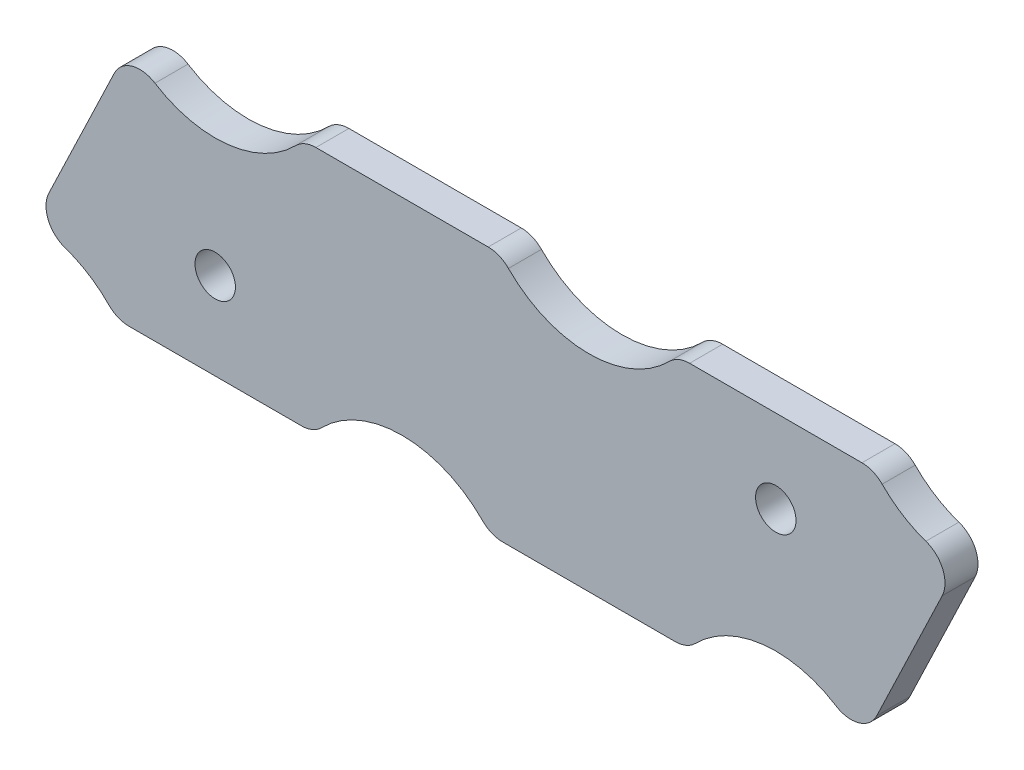
ISO-10303-21;
HEADER;
FILE_DESCRIPTION(('STEP AP214'),'2;1');
FILE_NAME('part.step','',(''),(''),'','','');
FILE_SCHEMA(('AUTOMOTIVE_DESIGN { 1 0 10303 214 1 1 1 1 }'));
ENDSEC;
DATA;
#1=APPLICATION_CONTEXT('core data for automotive mechanical design processes');
#2=APPLICATION_PROTOCOL_DEFINITION('international standard','automotive_design',2000,#1);
#3=PRODUCT_CONTEXT('',#1,'mechanical');
#4=PRODUCT('Part','Part','',(#3));
#5=PRODUCT_RELATED_PRODUCT_CATEGORY('part','',(#4));
#6=PRODUCT_DEFINITION_FORMATION('','',#4);
#7=PRODUCT_DEFINITION_CONTEXT('part definition',#1,'design');
#8=PRODUCT_DEFINITION('design','',#6,#7);
#9=PRODUCT_DEFINITION_SHAPE('','',#8);
#10=(LENGTH_UNIT() NAMED_UNIT(*) SI_UNIT(.MILLI.,.METRE.));
#11=(NAMED_UNIT(*) PLANE_ANGLE_UNIT() SI_UNIT($,.RADIAN.));
#12=(NAMED_UNIT(*) SI_UNIT($,.STERADIAN.) SOLID_ANGLE_UNIT());
#13=UNCERTAINTY_MEASURE_WITH_UNIT(LENGTH_MEASURE(1.E-05),#10,'distance_accuracy_value','');
#14=(GEOMETRIC_REPRESENTATION_CONTEXT(3) GLOBAL_UNCERTAINTY_ASSIGNED_CONTEXT((#13)) GLOBAL_UNIT_ASSIGNED_CONTEXT((#10,
#11,#12)) REPRESENTATION_CONTEXT('',''));
#15=CARTESIAN_POINT('',(0.,0.,0.));
#16=DIRECTION('',(0.,0.,1.));
#17=DIRECTION('',(1.,0.,0.));
#18=AXIS2_PLACEMENT_3D('',#15,#16,#17);
#19=CARTESIAN_POINT('',(0.,0.,2.032));
#20=DIRECTION('',(0.,0.,1.));
#21=DIRECTION('',(1.,0.,0.));
#22=AXIS2_PLACEMENT_3D('',#19,#20,#21);
#23=PLANE('',#22);
#24=CARTESIAN_POINT('',(56.7749999999999,25.3070138776259,2.032));
#25=DIRECTION('',(0.,0.,1.));
#26=DIRECTION('',(1.,0.,0.));
#27=AXIS2_PLACEMENT_3D('',#24,#25,#26);
#28=CIRCLE('',#27,1.2446);
#29=CARTESIAN_POINT('',(58.0195999999999,25.3070138776259,2.032));
#30=VERTEX_POINT('',#29);
#31=EDGE_CURVE('E403',#30,#30,#28,.T.);
#32=ORIENTED_EDGE('',*,*,#31,.F.);
#33=EDGE_LOOP('',(#32));
#34=FACE_BOUND('',#33,.T.);
#35=CARTESIAN_POINT('',(22.275,20.4920677095079,2.032));
#36=DIRECTION('',(0.,0.,1.));
#37=DIRECTION('',(1.,0.,0.));
#38=AXIS2_PLACEMENT_3D('',#35,#36,#37);
#39=CIRCLE('',#38,1.2446);
#40=CARTESIAN_POINT('',(23.5196,20.4920677095079,2.032));
#41=VERTEX_POINT('',#40);
#42=EDGE_CURVE('E53',#41,#41,#39,.T.);
#43=ORIENTED_EDGE('',*,*,#42,.F.);
#44=EDGE_LOOP('',(#43));
#45=FACE_BOUND('',#44,.T.);
#46=CARTESIAN_POINT('',(22.275,34.775,2.032));
#47=DIRECTION('',(0.,0.,-1.));
#48=DIRECTION('',(1.,0.,0.));
#49=AXIS2_PLACEMENT_3D('',#46,#47,#48);
#50=CIRCLE('',#49,6.954);
#51=CARTESIAN_POINT('',(27.228374403337,29.8942010878991,2.032));
#52=VERTEX_POINT('',#51);
#53=CARTESIAN_POINT('',(18.5691218534122,28.8907342715813,2.032));
#54=VERTEX_POINT('',#53);
#55=EDGE_CURVE('E356',#52,#54,#50,.T.);
#56=ORIENTED_EDGE('',*,*,#55,.T.);
#57=CARTESIAN_POINT('',(17.6386554680308,27.4133215649636,2.032));
#58=DIRECTION('',(0.,0.,1.));
#59=DIRECTION('',(1.,0.,0.));
#60=AXIS2_PLACEMENT_3D('',#57,#58,#59);
#61=CIRCLE('',#60,1.746);
#62=CARTESIAN_POINT('',(16.0640846818776,28.1678033999954,2.032));
#63=VERTEX_POINT('',#62);
#64=EDGE_CURVE('E291',#54,#63,#61,.T.);
#65=ORIENTED_EDGE('',*,*,#64,.T.);
#66=DIRECTION('',(-0.432120180430553,-0.901816028724632,0.));
#67=VECTOR('',#66,1.);
#68=CARTESIAN_POINT('',(16.0640846818776,28.1678033999954,2.032));
#69=LINE('',#68,#67);
#70=CARTESIAN_POINT('',(12.0331416883667,19.7554006309292,2.032));
#71=VERTEX_POINT('',#70);
#72=EDGE_CURVE('E294',#63,#71,#69,.T.);
#73=ORIENTED_EDGE('',*,*,#72,.T.);
#74=CARTESIAN_POINT('',(13.6077124745199,19.0009187958975,2.032));
#75=DIRECTION('',(0.,0.,1.));
#76=DIRECTION('',(1.,0.,0.));
#77=AXIS2_PLACEMENT_3D('',#74,#75,#76);
#78=CIRCLE('',#77,1.746);
#79=CARTESIAN_POINT('',(13.0392163848059,17.3500619892725,2.032));
#80=VERTEX_POINT('',#79);
#81=EDGE_CURVE('E61',#71,#80,#78,.T.);
#82=ORIENTED_EDGE('',*,*,#81,.T.);
#83=CARTESIAN_POINT('',(10.775,10.775,2.032));
#84=DIRECTION('',(0.,0.,-1.));
#85=DIRECTION('',(1.,0.,0.));
#86=AXIS2_PLACEMENT_3D('',#83,#84,#85);
#87=CIRCLE('',#86,6.954);
#88=CARTESIAN_POINT('',(15.728374403337,15.6557989121009,2.032));
#89=VERTEX_POINT('',#88);
#90=EDGE_CURVE('E214',#80,#89,#87,.T.);
#91=ORIENTED_EDGE('',*,*,#90,.T.);
#92=CARTESIAN_POINT('',(16.9720602975312,16.8812626596603,2.032));
#93=DIRECTION('',(0.,0.,1.));
#94=DIRECTION('',(1.,0.,0.));
#95=AXIS2_PLACEMENT_3D('',#92,#93,#94);
#96=CIRCLE('',#95,1.746);
#97=CARTESIAN_POINT('',(16.9720602975312,15.1352626596603,2.032));
#98=VERTEX_POINT('',#97);
#99=EDGE_CURVE('E299',#89,#98,#96,.T.);
#100=ORIENTED_EDGE('',*,*,#99,.T.);
#101=DIRECTION('',(1.,0.,0.));
#102=VECTOR('',#101,1.);
#103=CARTESIAN_POINT('',(16.9720602975312,15.1352626596603,2.032));
#104=LINE('',#103,#102);
#105=CARTESIAN_POINT('',(27.5779397024688,15.1352626596603,2.032));
#106=VERTEX_POINT('',#105);
#107=EDGE_CURVE('E302',#98,#106,#104,.T.);
#108=ORIENTED_EDGE('',*,*,#107,.T.);
#109=CARTESIAN_POINT('',(27.5779397024688,16.8812626596603,2.032));
#110=DIRECTION('',(0.,0.,1.));
#111=DIRECTION('',(1.,0.,0.));
#112=AXIS2_PLACEMENT_3D('',#109,#110,#111);
#113=CIRCLE('',#112,1.746);
#114=CARTESIAN_POINT('',(28.821625596663,15.6557989121009,2.032));
#115=VERTEX_POINT('',#114);
#116=EDGE_CURVE('E305',#106,#115,#113,.T.);
#117=ORIENTED_EDGE('',*,*,#116,.T.);
#118=CARTESIAN_POINT('',(33.775,10.775,2.032));
#119=DIRECTION('',(0.,0.,-1.));
#120=DIRECTION('',(1.,0.,0.));
#121=AXIS2_PLACEMENT_3D('',#118,#119,#120);
#122=CIRCLE('',#121,6.954);
#123=CARTESIAN_POINT('',(38.728374403337,15.6557989121009,2.032));
#124=VERTEX_POINT('',#123);
#125=EDGE_CURVE('E308',#115,#124,#122,.T.);
#126=ORIENTED_EDGE('',*,*,#125,.T.);
#127=CARTESIAN_POINT('',(39.9720602975312,16.8812626596603,2.032));
#128=DIRECTION('',(0.,0.,1.));
#129=DIRECTION('',(1.,0.,0.));
#130=AXIS2_PLACEMENT_3D('',#127,#128,#129);
#131=CIRCLE('',#130,1.746);
#132=CARTESIAN_POINT('',(39.9720602975312,15.1352626596604,2.032));
#133=VERTEX_POINT('',#132);
#134=EDGE_CURVE('E311',#124,#133,#131,.T.);
#135=ORIENTED_EDGE('',*,*,#134,.T.);
#136=DIRECTION('',(1.,0.,0.));
#137=VECTOR('',#136,1.);
#138=CARTESIAN_POINT('',(39.9720602975312,15.1352626596604,2.032));
#139=LINE('',#138,#137);
#140=CARTESIAN_POINT('',(50.5779397024688,15.1352626596603,2.032));
#141=VERTEX_POINT('',#140);
#142=EDGE_CURVE('E314',#133,#141,#139,.T.);
#143=ORIENTED_EDGE('',*,*,#142,.T.);
#144=CARTESIAN_POINT('',(50.5779397024688,16.8812626596603,2.032));
#145=DIRECTION('',(0.,0.,1.));
#146=DIRECTION('',(1.,0.,0.));
#147=AXIS2_PLACEMENT_3D('',#144,#145,#146);
#148=CIRCLE('',#147,1.746);
#149=CARTESIAN_POINT('',(51.821625596663,15.6557989121009,2.032));
#150=VERTEX_POINT('',#149);
#151=EDGE_CURVE('E317',#141,#150,#148,.T.);
#152=ORIENTED_EDGE('',*,*,#151,.T.);
#153=CARTESIAN_POINT('',(56.775,10.775,2.032));
#154=DIRECTION('',(0.,0.,-1.));
#155=DIRECTION('',(1.,0.,0.));
#156=AXIS2_PLACEMENT_3D('',#153,#154,#155);
#157=CIRCLE('',#156,6.95400000000001);
#158=CARTESIAN_POINT('',(60.4808781465878,16.6592657284187,2.032));
#159=VERTEX_POINT('',#158);
#160=EDGE_CURVE('E320',#150,#159,#157,.T.);
#161=ORIENTED_EDGE('',*,*,#160,.T.);
#162=CARTESIAN_POINT('',(61.4113445319692,18.1366784350364,2.032));
#163=DIRECTION('',(0.,0.,1.));
#164=DIRECTION('',(1.,0.,0.));
#165=AXIS2_PLACEMENT_3D('',#162,#163,#164);
#166=CIRCLE('',#165,1.746);
#167=CARTESIAN_POINT('',(62.9859153181224,17.3821966000046,2.032));
#168=VERTEX_POINT('',#167);
#169=EDGE_CURVE('E323',#159,#168,#166,.T.);
#170=ORIENTED_EDGE('',*,*,#169,.T.);
#171=DIRECTION('',(0.432120180430553,0.901816028724632,0.));
#172=VECTOR('',#171,1.);
#173=CARTESIAN_POINT('',(62.9859153181224,17.3821966000046,2.032));
#174=LINE('',#173,#172);
#175=CARTESIAN_POINT('',(67.0168583116333,25.7945993690708,2.032));
#176=VERTEX_POINT('',#175);
#177=EDGE_CURVE('E326',#168,#176,#174,.T.);
#178=ORIENTED_EDGE('',*,*,#177,.T.);
#179=CARTESIAN_POINT('',(65.4422875254801,26.5490812041025,2.032));
#180=DIRECTION('',(0.,0.,1.));
#181=DIRECTION('',(1.,0.,0.));
#182=AXIS2_PLACEMENT_3D('',#179,#180,#181);
#183=CIRCLE('',#182,1.746);
#184=CARTESIAN_POINT('',(66.0107836151941,28.1999380107275,2.032));
#185=VERTEX_POINT('',#184);
#186=EDGE_CURVE('E329',#176,#185,#183,.T.);
#187=ORIENTED_EDGE('',*,*,#186,.T.);
#188=CARTESIAN_POINT('',(68.275,34.775,2.032));
#189=DIRECTION('',(0.,0.,-1.));
#190=DIRECTION('',(1.,0.,0.));
#191=AXIS2_PLACEMENT_3D('',#188,#189,#190);
#192=CIRCLE('',#191,6.95400000000001);
#193=CARTESIAN_POINT('',(63.3216255966629,29.8942010878991,2.032));
#194=VERTEX_POINT('',#193);
#195=EDGE_CURVE('E332',#185,#194,#192,.T.);
#196=ORIENTED_EDGE('',*,*,#195,.T.);
#197=CARTESIAN_POINT('',(62.0779397024688,28.6687373403397,2.032));
#198=DIRECTION('',(0.,0.,1.));
#199=DIRECTION('',(1.,0.,0.));
#200=AXIS2_PLACEMENT_3D('',#197,#198,#199);
#201=CIRCLE('',#200,1.746);
#202=CARTESIAN_POINT('',(62.0779397024688,30.4147373403397,2.032));
#203=VERTEX_POINT('',#202);
#204=EDGE_CURVE('E335',#194,#203,#201,.T.);
#205=ORIENTED_EDGE('',*,*,#204,.T.);
#206=DIRECTION('',(-1.,0.,0.));
#207=VECTOR('',#206,1.);
#208=CARTESIAN_POINT('',(62.0779397024688,30.4147373403397,2.032));
#209=LINE('',#208,#207);
#210=CARTESIAN_POINT('',(51.4720602975312,30.4147373403397,2.032));
#211=VERTEX_POINT('',#210);
#212=EDGE_CURVE('E338',#203,#211,#209,.T.);
#213=ORIENTED_EDGE('',*,*,#212,.T.);
#214=CARTESIAN_POINT('',(51.4720602975312,28.6687373403397,2.032));
#215=DIRECTION('',(0.,0.,1.));
#216=DIRECTION('',(1.,0.,0.));
#217=AXIS2_PLACEMENT_3D('',#214,#215,#216);
#218=CIRCLE('',#217,1.746);
#219=CARTESIAN_POINT('',(50.228374403337,29.8942010878991,2.032));
#220=VERTEX_POINT('',#219);
#221=EDGE_CURVE('E341',#211,#220,#218,.T.);
#222=ORIENTED_EDGE('',*,*,#221,.T.);
#223=CARTESIAN_POINT('',(45.275,34.775,2.032));
#224=DIRECTION('',(0.,0.,-1.));
#225=DIRECTION('',(1.,0.,0.));
#226=AXIS2_PLACEMENT_3D('',#223,#224,#225);
#227=CIRCLE('',#226,6.954);
#228=CARTESIAN_POINT('',(40.321625596663,29.8942010878991,2.032));
#229=VERTEX_POINT('',#228);
#230=EDGE_CURVE('E344',#220,#229,#227,.T.);
#231=ORIENTED_EDGE('',*,*,#230,.T.);
#232=CARTESIAN_POINT('',(39.0779397024688,28.6687373403397,2.032));
#233=DIRECTION('',(0.,0.,1.));
#234=DIRECTION('',(1.,0.,0.));
#235=AXIS2_PLACEMENT_3D('',#232,#233,#234);
#236=CIRCLE('',#235,1.746);
#237=CARTESIAN_POINT('',(39.0779397024688,30.4147373403397,2.032));
#238=VERTEX_POINT('',#237);
#239=EDGE_CURVE('E347',#229,#238,#236,.T.);
#240=ORIENTED_EDGE('',*,*,#239,.T.);
#241=DIRECTION('',(-1.,0.,0.));
#242=VECTOR('',#241,1.);
#243=CARTESIAN_POINT('',(39.0779397024688,30.4147373403397,2.032));
#244=LINE('',#243,#242);
#245=CARTESIAN_POINT('',(28.4720602975312,30.4147373403397,2.032));
#246=VERTEX_POINT('',#245);
#247=EDGE_CURVE('E350',#238,#246,#244,.T.);
#248=ORIENTED_EDGE('',*,*,#247,.T.);
#249=CARTESIAN_POINT('',(28.4720602975312,28.6687373403397,2.032));
#250=DIRECTION('',(0.,0.,1.));
#251=DIRECTION('',(1.,0.,0.));
#252=AXIS2_PLACEMENT_3D('',#249,#250,#251);
#253=CIRCLE('',#252,1.746);
#254=EDGE_CURVE('E353',#246,#52,#253,.T.);
#255=ORIENTED_EDGE('',*,*,#254,.T.);
#256=EDGE_LOOP('',(#56,#65,#73,#82,#91,#100,#108,#117,#126,#135,#143,#152,#161,#170,#178,#187,
#196,#205,#213,#222,#231,#240,#248,#255));
#257=FACE_BOUND('',#256,.T.);
#258=ADVANCED_FACE('F44',(#34,#45,#257),#23,.T.);
#259=CARTESIAN_POINT('',(0.,0.,0.));
#260=DIRECTION('',(0.,0.,1.));
#261=DIRECTION('',(1.,0.,0.));
#262=AXIS2_PLACEMENT_3D('',#259,#260,#261);
#263=PLANE('',#262);
#264=CARTESIAN_POINT('',(56.7749999999999,25.3070138776259,0.));
#265=DIRECTION('',(0.,0.,1.));
#266=DIRECTION('',(1.,0.,0.));
#267=AXIS2_PLACEMENT_3D('',#264,#265,#266);
#268=CIRCLE('',#267,1.2446);
#269=CARTESIAN_POINT('',(58.0195999999999,25.3070138776259,0.));
#270=VERTEX_POINT('',#269);
#271=EDGE_CURVE('E48',#270,#270,#268,.T.);
#272=ORIENTED_EDGE('',*,*,#271,.T.);
#273=EDGE_LOOP('',(#272));
#274=FACE_BOUND('',#273,.T.);
#275=CARTESIAN_POINT('',(22.275,20.4920677095079,0.));
#276=DIRECTION('',(0.,0.,1.));
#277=DIRECTION('',(1.,0.,0.));
#278=AXIS2_PLACEMENT_3D('',#275,#276,#277);
#279=CIRCLE('',#278,1.2446);
#280=CARTESIAN_POINT('',(23.5196,20.4920677095079,0.));
#281=VERTEX_POINT('',#280);
#282=EDGE_CURVE('E11',#281,#281,#279,.T.);
#283=ORIENTED_EDGE('',*,*,#282,.T.);
#284=EDGE_LOOP('',(#283));
#285=FACE_BOUND('',#284,.T.);
#286=CARTESIAN_POINT('',(17.6386554680308,27.4133215649636,0.));
#287=DIRECTION('',(0.,0.,1.));
#288=DIRECTION('',(1.,0.,0.));
#289=AXIS2_PLACEMENT_3D('',#286,#287,#288);
#290=CIRCLE('',#289,1.746);
#291=CARTESIAN_POINT('',(18.5691218534122,28.8907342715813,0.));
#292=VERTEX_POINT('',#291);
#293=CARTESIAN_POINT('',(16.0640846818776,28.1678033999954,0.));
#294=VERTEX_POINT('',#293);
#295=EDGE_CURVE('E69',#292,#294,#290,.T.);
#296=ORIENTED_EDGE('',*,*,#295,.F.);
#297=CARTESIAN_POINT('',(22.275,34.775,0.));
#298=DIRECTION('',(0.,0.,-1.));
#299=DIRECTION('',(1.,0.,0.));
#300=AXIS2_PLACEMENT_3D('',#297,#298,#299);
#301=CIRCLE('',#300,6.954);
#302=CARTESIAN_POINT('',(27.228374403337,29.8942010878991,0.));
#303=VERTEX_POINT('',#302);
#304=EDGE_CURVE('E287',#303,#292,#301,.T.);
#305=ORIENTED_EDGE('',*,*,#304,.F.);
#306=CARTESIAN_POINT('',(28.4720602975312,28.6687373403397,0.));
#307=DIRECTION('',(0.,0.,1.));
#308=DIRECTION('',(1.,0.,0.));
#309=AXIS2_PLACEMENT_3D('',#306,#307,#308);
#310=CIRCLE('',#309,1.746);
#311=CARTESIAN_POINT('',(28.4720602975312,30.4147373403397,0.));
#312=VERTEX_POINT('',#311);
#313=EDGE_CURVE('E284',#312,#303,#310,.T.);
#314=ORIENTED_EDGE('',*,*,#313,.F.);
#315=DIRECTION('',(-1.,0.,0.));
#316=VECTOR('',#315,1.);
#317=CARTESIAN_POINT('',(39.0779397024688,30.4147373403397,0.));
#318=LINE('',#317,#316);
#319=CARTESIAN_POINT('',(39.0779397024688,30.4147373403397,0.));
#320=VERTEX_POINT('',#319);
#321=EDGE_CURVE('E281',#320,#312,#318,.T.);
#322=ORIENTED_EDGE('',*,*,#321,.F.);
#323=CARTESIAN_POINT('',(39.0779397024688,28.6687373403397,0.));
#324=DIRECTION('',(0.,0.,1.));
#325=DIRECTION('',(1.,0.,0.));
#326=AXIS2_PLACEMENT_3D('',#323,#324,#325);
#327=CIRCLE('',#326,1.746);
#328=CARTESIAN_POINT('',(40.321625596663,29.8942010878991,0.));
#329=VERTEX_POINT('',#328);
#330=EDGE_CURVE('E278',#329,#320,#327,.T.);
#331=ORIENTED_EDGE('',*,*,#330,.F.);
#332=CARTESIAN_POINT('',(45.275,34.775,0.));
#333=DIRECTION('',(0.,0.,-1.));
#334=DIRECTION('',(1.,0.,0.));
#335=AXIS2_PLACEMENT_3D('',#332,#333,#334);
#336=CIRCLE('',#335,6.954);
#337=CARTESIAN_POINT('',(50.228374403337,29.8942010878991,0.));
#338=VERTEX_POINT('',#337);
#339=EDGE_CURVE('E275',#338,#329,#336,.T.);
#340=ORIENTED_EDGE('',*,*,#339,.F.);
#341=CARTESIAN_POINT('',(51.4720602975312,28.6687373403397,0.));
#342=DIRECTION('',(0.,0.,1.));
#343=DIRECTION('',(1.,0.,0.));
#344=AXIS2_PLACEMENT_3D('',#341,#342,#343);
#345=CIRCLE('',#344,1.746);
#346=CARTESIAN_POINT('',(51.4720602975312,30.4147373403397,0.));
#347=VERTEX_POINT('',#346);
#348=EDGE_CURVE('E272',#347,#338,#345,.T.);
#349=ORIENTED_EDGE('',*,*,#348,.F.);
#350=DIRECTION('',(-1.,0.,0.));
#351=VECTOR('',#350,1.);
#352=CARTESIAN_POINT('',(62.0779397024688,30.4147373403397,0.));
#353=LINE('',#352,#351);
#354=CARTESIAN_POINT('',(62.0779397024688,30.4147373403397,0.));
#355=VERTEX_POINT('',#354);
#356=EDGE_CURVE('E269',#355,#347,#353,.T.);
#357=ORIENTED_EDGE('',*,*,#356,.F.);
#358=CARTESIAN_POINT('',(62.0779397024688,28.6687373403397,0.));
#359=DIRECTION('',(0.,0.,1.));
#360=DIRECTION('',(1.,0.,0.));
#361=AXIS2_PLACEMENT_3D('',#358,#359,#360);
#362=CIRCLE('',#361,1.746);
#363=CARTESIAN_POINT('',(63.3216255966629,29.8942010878991,0.));
#364=VERTEX_POINT('',#363);
#365=EDGE_CURVE('E266',#364,#355,#362,.T.);
#366=ORIENTED_EDGE('',*,*,#365,.F.);
#367=CARTESIAN_POINT('',(68.275,34.775,0.));
#368=DIRECTION('',(0.,0.,-1.));
#369=DIRECTION('',(1.,0.,0.));
#370=AXIS2_PLACEMENT_3D('',#367,#368,#369);
#371=CIRCLE('',#370,6.95400000000001);
#372=CARTESIAN_POINT('',(66.0107836151941,28.1999380107275,0.));
#373=VERTEX_POINT('',#372);
#374=EDGE_CURVE('E263',#373,#364,#371,.T.);
#375=ORIENTED_EDGE('',*,*,#374,.F.);
#376=CARTESIAN_POINT('',(65.4422875254801,26.5490812041025,0.));
#377=DIRECTION('',(0.,0.,1.));
#378=DIRECTION('',(1.,0.,0.));
#379=AXIS2_PLACEMENT_3D('',#376,#377,#378);
#380=CIRCLE('',#379,1.746);
#381=CARTESIAN_POINT('',(67.0168583116333,25.7945993690708,0.));
#382=VERTEX_POINT('',#381);
#383=EDGE_CURVE('E260',#382,#373,#380,.T.);
#384=ORIENTED_EDGE('',*,*,#383,.F.);
#385=DIRECTION('',(0.432120180430553,0.901816028724632,0.));
#386=VECTOR('',#385,1.);
#387=CARTESIAN_POINT('',(62.9859153181224,17.3821966000046,0.));
#388=LINE('',#387,#386);
#389=CARTESIAN_POINT('',(62.9859153181224,17.3821966000046,0.));
#390=VERTEX_POINT('',#389);
#391=EDGE_CURVE('E257',#390,#382,#388,.T.);
#392=ORIENTED_EDGE('',*,*,#391,.F.);
#393=CARTESIAN_POINT('',(61.4113445319692,18.1366784350364,0.));
#394=DIRECTION('',(0.,0.,1.));
#395=DIRECTION('',(1.,0.,0.));
#396=AXIS2_PLACEMENT_3D('',#393,#394,#395);
#397=CIRCLE('',#396,1.746);
#398=CARTESIAN_POINT('',(60.4808781465878,16.6592657284187,0.));
#399=VERTEX_POINT('',#398);
#400=EDGE_CURVE('E254',#399,#390,#397,.T.);
#401=ORIENTED_EDGE('',*,*,#400,.F.);
#402=CARTESIAN_POINT('',(56.775,10.775,0.));
#403=DIRECTION('',(0.,0.,-1.));
#404=DIRECTION('',(1.,0.,0.));
#405=AXIS2_PLACEMENT_3D('',#402,#403,#404);
#406=CIRCLE('',#405,6.95400000000001);
#407=CARTESIAN_POINT('',(51.821625596663,15.6557989121009,0.));
#408=VERTEX_POINT('',#407);
#409=EDGE_CURVE('E251',#408,#399,#406,.T.);
#410=ORIENTED_EDGE('',*,*,#409,.F.);
#411=CARTESIAN_POINT('',(50.5779397024688,16.8812626596603,0.));
#412=DIRECTION('',(0.,0.,1.));
#413=DIRECTION('',(1.,0.,0.));
#414=AXIS2_PLACEMENT_3D('',#411,#412,#413);
#415=CIRCLE('',#414,1.746);
#416=CARTESIAN_POINT('',(50.5779397024688,15.1352626596603,0.));
#417=VERTEX_POINT('',#416);
#418=EDGE_CURVE('E248',#417,#408,#415,.T.);
#419=ORIENTED_EDGE('',*,*,#418,.F.);
#420=DIRECTION('',(1.,0.,0.));
#421=VECTOR('',#420,1.);
#422=CARTESIAN_POINT('',(39.9720602975312,15.1352626596604,0.));
#423=LINE('',#422,#421);
#424=CARTESIAN_POINT('',(39.9720602975312,15.1352626596604,0.));
#425=VERTEX_POINT('',#424);
#426=EDGE_CURVE('E245',#425,#417,#423,.T.);
#427=ORIENTED_EDGE('',*,*,#426,.F.);
#428=CARTESIAN_POINT('',(39.9720602975312,16.8812626596603,0.));
#429=DIRECTION('',(0.,0.,1.));
#430=DIRECTION('',(1.,0.,0.));
#431=AXIS2_PLACEMENT_3D('',#428,#429,#430);
#432=CIRCLE('',#431,1.746);
#433=CARTESIAN_POINT('',(38.728374403337,15.6557989121009,0.));
#434=VERTEX_POINT('',#433);
#435=EDGE_CURVE('E242',#434,#425,#432,.T.);
#436=ORIENTED_EDGE('',*,*,#435,.F.);
#437=CARTESIAN_POINT('',(33.775,10.775,0.));
#438=DIRECTION('',(0.,0.,-1.));
#439=DIRECTION('',(1.,0.,0.));
#440=AXIS2_PLACEMENT_3D('',#437,#438,#439);
#441=CIRCLE('',#440,6.954);
#442=CARTESIAN_POINT('',(28.821625596663,15.6557989121009,0.));
#443=VERTEX_POINT('',#442);
#444=EDGE_CURVE('E239',#443,#434,#441,.T.);
#445=ORIENTED_EDGE('',*,*,#444,.F.);
#446=CARTESIAN_POINT('',(27.5779397024688,16.8812626596603,0.));
#447=DIRECTION('',(0.,0.,1.));
#448=DIRECTION('',(1.,0.,0.));
#449=AXIS2_PLACEMENT_3D('',#446,#447,#448);
#450=CIRCLE('',#449,1.746);
#451=CARTESIAN_POINT('',(27.5779397024688,15.1352626596603,0.));
#452=VERTEX_POINT('',#451);
#453=EDGE_CURVE('E236',#452,#443,#450,.T.);
#454=ORIENTED_EDGE('',*,*,#453,.F.);
#455=DIRECTION('',(1.,0.,0.));
#456=VECTOR('',#455,1.);
#457=CARTESIAN_POINT('',(16.9720602975312,15.1352626596603,0.));
#458=LINE('',#457,#456);
#459=CARTESIAN_POINT('',(16.9720602975312,15.1352626596603,0.));
#460=VERTEX_POINT('',#459);
#461=EDGE_CURVE('E230',#460,#452,#458,.T.);
#462=ORIENTED_EDGE('',*,*,#461,.F.);
#463=CARTESIAN_POINT('',(16.9720602975312,16.8812626596603,0.));
#464=DIRECTION('',(0.,0.,1.));
#465=DIRECTION('',(1.,0.,0.));
#466=AXIS2_PLACEMENT_3D('',#463,#464,#465);
#467=CIRCLE('',#466,1.746);
#468=CARTESIAN_POINT('',(15.728374403337,15.6557989121009,0.));
#469=VERTEX_POINT('',#468);
#470=EDGE_CURVE('E228',#469,#460,#467,.T.);
#471=ORIENTED_EDGE('',*,*,#470,.F.);
#472=CARTESIAN_POINT('',(10.775,10.775,0.));
#473=DIRECTION('',(0.,0.,-1.));
#474=DIRECTION('',(1.,0.,0.));
#475=AXIS2_PLACEMENT_3D('',#472,#473,#474);
#476=CIRCLE('',#475,6.954);
#477=CARTESIAN_POINT('',(13.0392163848059,17.3500619892725,0.));
#478=VERTEX_POINT('',#477);
#479=EDGE_CURVE('E211',#478,#469,#476,.T.);
#480=ORIENTED_EDGE('',*,*,#479,.F.);
#481=CARTESIAN_POINT('',(13.6077124745199,19.0009187958975,0.));
#482=DIRECTION('',(0.,0.,1.));
#483=DIRECTION('',(1.,0.,0.));
#484=AXIS2_PLACEMENT_3D('',#481,#482,#483);
#485=CIRCLE('',#484,1.746);
#486=CARTESIAN_POINT('',(12.0331416883667,19.7554006309292,0.));
#487=VERTEX_POINT('',#486);
#488=EDGE_CURVE('E219',#487,#478,#485,.T.);
#489=ORIENTED_EDGE('',*,*,#488,.F.);
#490=DIRECTION('',(-0.432120180430553,-0.901816028724632,0.));
#491=VECTOR('',#490,1.);
#492=CARTESIAN_POINT('',(16.0640846818776,28.1678033999954,0.));
#493=LINE('',#492,#491);
#494=EDGE_CURVE('E224',#294,#487,#493,.T.);
#495=ORIENTED_EDGE('',*,*,#494,.F.);
#496=EDGE_LOOP('',(#296,#305,#314,#322,#331,#340,#349,#357,#366,#375,#384,#392,#401,#410,#419,
#427,#436,#445,#454,#462,#471,#480,#489,#495));
#497=FACE_BOUND('',#496,.T.);
#498=ADVANCED_FACE('F46',(#274,#285,#497),#263,.F.);
#499=CARTESIAN_POINT('',(56.7749999999999,25.3070138776259,0.));
#500=DIRECTION('',(0.,0.,1.));
#501=DIRECTION('',(1.,0.,0.));
#502=AXIS2_PLACEMENT_3D('',#499,#500,#501);
#503=CYLINDRICAL_SURFACE('',#502,1.2446);
#504=ORIENTED_EDGE('',*,*,#271,.F.);
#505=EDGE_LOOP('',(#504));
#506=FACE_BOUND('',#505,.T.);
#507=ORIENTED_EDGE('',*,*,#31,.T.);
#508=EDGE_LOOP('',(#507));
#509=FACE_BOUND('',#508,.T.);
#510=ADVANCED_FACE('F412',(#506,#509),#503,.F.);
#511=CARTESIAN_POINT('',(22.275,20.4920677095079,0.));
#512=DIRECTION('',(0.,0.,1.));
#513=DIRECTION('',(1.,0.,0.));
#514=AXIS2_PLACEMENT_3D('',#511,#512,#513);
#515=CYLINDRICAL_SURFACE('',#514,1.2446);
#516=ORIENTED_EDGE('',*,*,#282,.F.);
#517=EDGE_LOOP('',(#516));
#518=FACE_BOUND('',#517,.T.);
#519=ORIENTED_EDGE('',*,*,#42,.T.);
#520=EDGE_LOOP('',(#519));
#521=FACE_BOUND('',#520,.T.);
#522=ADVANCED_FACE('F414',(#518,#521),#515,.F.);
#523=CARTESIAN_POINT('',(17.6386554680308,27.4133215649636,0.));
#524=DIRECTION('',(0.,0.,1.));
#525=DIRECTION('',(1.,0.,0.));
#526=AXIS2_PLACEMENT_3D('',#523,#524,#525);
#527=CYLINDRICAL_SURFACE('',#526,1.746);
#528=ORIENTED_EDGE('',*,*,#64,.F.);
#529=DIRECTION('',(0.,0.,1.));
#530=VECTOR('',#529,1.);
#531=CARTESIAN_POINT('',(18.5691218534122,28.8907342715813,0.));
#532=LINE('',#531,#530);
#533=EDGE_CURVE('E359',#292,#54,#532,.T.);
#534=ORIENTED_EDGE('',*,*,#533,.F.);
#535=ORIENTED_EDGE('',*,*,#295,.T.);
#536=DIRECTION('',(0.,0.,1.));
#537=VECTOR('',#536,1.);
#538=CARTESIAN_POINT('',(16.0640846818776,28.1678033999954,0.));
#539=LINE('',#538,#537);
#540=EDGE_CURVE('E290',#294,#63,#539,.T.);
#541=ORIENTED_EDGE('',*,*,#540,.T.);
#542=EDGE_LOOP('',(#528,#534,#535,#541));
#543=FACE_BOUND('',#542,.T.);
#544=ADVANCED_FACE('F419',(#543),#527,.T.);
#545=CARTESIAN_POINT('',(22.275,34.775,0.));
#546=DIRECTION('',(0.,0.,1.));
#547=DIRECTION('',(1.,0.,0.));
#548=AXIS2_PLACEMENT_3D('',#545,#546,#547);
#549=CYLINDRICAL_SURFACE('',#548,6.954);
#550=ORIENTED_EDGE('',*,*,#55,.F.);
#551=DIRECTION('',(0.,0.,1.));
#552=VECTOR('',#551,1.);
#553=CARTESIAN_POINT('',(27.228374403337,29.8942010878991,0.));
#554=LINE('',#553,#552);
#555=EDGE_CURVE('E361',#303,#52,#554,.T.);
#556=ORIENTED_EDGE('',*,*,#555,.F.);
#557=ORIENTED_EDGE('',*,*,#304,.T.);
#558=ORIENTED_EDGE('',*,*,#533,.T.);
#559=EDGE_LOOP('',(#550,#556,#557,#558));
#560=FACE_BOUND('',#559,.T.);
#561=ADVANCED_FACE('F434',(#560),#549,.F.);
#562=CARTESIAN_POINT('',(28.4720602975312,28.6687373403397,0.));
#563=DIRECTION('',(0.,0.,1.));
#564=DIRECTION('',(1.,0.,0.));
#565=AXIS2_PLACEMENT_3D('',#562,#563,#564);
#566=CYLINDRICAL_SURFACE('',#565,1.746);
#567=ORIENTED_EDGE('',*,*,#254,.F.);
#568=DIRECTION('',(0.,0.,1.));
#569=VECTOR('',#568,1.);
#570=CARTESIAN_POINT('',(28.4720602975312,30.4147373403397,0.));
#571=LINE('',#570,#569);
#572=EDGE_CURVE('E363',#312,#246,#571,.T.);
#573=ORIENTED_EDGE('',*,*,#572,.F.);
#574=ORIENTED_EDGE('',*,*,#313,.T.);
#575=ORIENTED_EDGE('',*,*,#555,.T.);
#576=EDGE_LOOP('',(#567,#573,#574,#575));
#577=FACE_BOUND('',#576,.T.);
#578=ADVANCED_FACE('F511',(#577),#566,.T.);
#579=CARTESIAN_POINT('',(39.0779397024688,30.4147373403397,0.));
#580=DIRECTION('',(0.,1.,0.));
#581=DIRECTION('',(-1.,0.,0.));
#582=AXIS2_PLACEMENT_3D('',#579,#580,#581);
#583=PLANE('',#582);
#584=ORIENTED_EDGE('',*,*,#247,.F.);
#585=DIRECTION('',(0.,0.,1.));
#586=VECTOR('',#585,1.);
#587=CARTESIAN_POINT('',(39.0779397024688,30.4147373403397,0.));
#588=LINE('',#587,#586);
#589=EDGE_CURVE('E365',#320,#238,#588,.T.);
#590=ORIENTED_EDGE('',*,*,#589,.F.);
#591=ORIENTED_EDGE('',*,*,#321,.T.);
#592=ORIENTED_EDGE('',*,*,#572,.T.);
#593=EDGE_LOOP('',(#584,#590,#591,#592));
#594=FACE_BOUND('',#593,.T.);
#595=ADVANCED_FACE('F508',(#594),#583,.T.);
#596=CARTESIAN_POINT('',(39.0779397024688,28.6687373403397,0.));
#597=DIRECTION('',(0.,0.,1.));
#598=DIRECTION('',(1.,0.,0.));
#599=AXIS2_PLACEMENT_3D('',#596,#597,#598);
#600=CYLINDRICAL_SURFACE('',#599,1.746);
#601=ORIENTED_EDGE('',*,*,#239,.F.);
#602=DIRECTION('',(0.,0.,1.));
#603=VECTOR('',#602,1.);
#604=CARTESIAN_POINT('',(40.321625596663,29.8942010878991,0.));
#605=LINE('',#604,#603);
#606=EDGE_CURVE('E367',#329,#229,#605,.T.);
#607=ORIENTED_EDGE('',*,*,#606,.F.);
#608=ORIENTED_EDGE('',*,*,#330,.T.);
#609=ORIENTED_EDGE('',*,*,#589,.T.);
#610=EDGE_LOOP('',(#601,#607,#608,#609));
#611=FACE_BOUND('',#610,.T.);
#612=ADVANCED_FACE('F504',(#611),#600,.T.);
#613=CARTESIAN_POINT('',(45.275,34.775,0.));
#614=DIRECTION('',(0.,0.,1.));
#615=DIRECTION('',(1.,0.,0.));
#616=AXIS2_PLACEMENT_3D('',#613,#614,#615);
#617=CYLINDRICAL_SURFACE('',#616,6.954);
#618=ORIENTED_EDGE('',*,*,#230,.F.);
#619=DIRECTION('',(0.,0.,1.));
#620=VECTOR('',#619,1.);
#621=CARTESIAN_POINT('',(50.228374403337,29.8942010878991,0.));
#622=LINE('',#621,#620);
#623=EDGE_CURVE('E369',#338,#220,#622,.T.);
#624=ORIENTED_EDGE('',*,*,#623,.F.);
#625=ORIENTED_EDGE('',*,*,#339,.T.);
#626=ORIENTED_EDGE('',*,*,#606,.T.);
#627=EDGE_LOOP('',(#618,#624,#625,#626));
#628=FACE_BOUND('',#627,.T.);
#629=ADVANCED_FACE('F500',(#628),#617,.F.);
#630=CARTESIAN_POINT('',(51.4720602975312,28.6687373403397,0.));
#631=DIRECTION('',(0.,0.,1.));
#632=DIRECTION('',(1.,0.,0.));
#633=AXIS2_PLACEMENT_3D('',#630,#631,#632);
#634=CYLINDRICAL_SURFACE('',#633,1.746);
#635=ORIENTED_EDGE('',*,*,#221,.F.);
#636=DIRECTION('',(0.,0.,1.));
#637=VECTOR('',#636,1.);
#638=CARTESIAN_POINT('',(51.4720602975312,30.4147373403397,0.));
#639=LINE('',#638,#637);
#640=EDGE_CURVE('E371',#347,#211,#639,.T.);
#641=ORIENTED_EDGE('',*,*,#640,.F.);
#642=ORIENTED_EDGE('',*,*,#348,.T.);
#643=ORIENTED_EDGE('',*,*,#623,.T.);
#644=EDGE_LOOP('',(#635,#641,#642,#643));
#645=FACE_BOUND('',#644,.T.);
#646=ADVANCED_FACE('F496',(#645),#634,.T.);
#647=CARTESIAN_POINT('',(62.0779397024688,30.4147373403397,0.));
#648=DIRECTION('',(0.,1.,0.));
#649=DIRECTION('',(-1.,0.,0.));
#650=AXIS2_PLACEMENT_3D('',#647,#648,#649);
#651=PLANE('',#650);
#652=ORIENTED_EDGE('',*,*,#212,.F.);
#653=DIRECTION('',(0.,0.,1.));
#654=VECTOR('',#653,1.);
#655=CARTESIAN_POINT('',(62.0779397024688,30.4147373403397,0.));
#656=LINE('',#655,#654);
#657=EDGE_CURVE('E373',#355,#203,#656,.T.);
#658=ORIENTED_EDGE('',*,*,#657,.F.);
#659=ORIENTED_EDGE('',*,*,#356,.T.);
#660=ORIENTED_EDGE('',*,*,#640,.T.);
#661=EDGE_LOOP('',(#652,#658,#659,#660));
#662=FACE_BOUND('',#661,.T.);
#663=ADVANCED_FACE('F492',(#662),#651,.T.);
#664=CARTESIAN_POINT('',(62.0779397024688,28.6687373403397,0.));
#665=DIRECTION('',(0.,0.,1.));
#666=DIRECTION('',(1.,0.,0.));
#667=AXIS2_PLACEMENT_3D('',#664,#665,#666);
#668=CYLINDRICAL_SURFACE('',#667,1.746);
#669=ORIENTED_EDGE('',*,*,#204,.F.);
#670=DIRECTION('',(0.,0.,1.));
#671=VECTOR('',#670,1.);
#672=CARTESIAN_POINT('',(63.3216255966629,29.8942010878991,0.));
#673=LINE('',#672,#671);
#674=EDGE_CURVE('E375',#364,#194,#673,.T.);
#675=ORIENTED_EDGE('',*,*,#674,.F.);
#676=ORIENTED_EDGE('',*,*,#365,.T.);
#677=ORIENTED_EDGE('',*,*,#657,.T.);
#678=EDGE_LOOP('',(#669,#675,#676,#677));
#679=FACE_BOUND('',#678,.T.);
#680=ADVANCED_FACE('F488',(#679),#668,.T.);
#681=CARTESIAN_POINT('',(68.275,34.775,0.));
#682=DIRECTION('',(0.,0.,1.));
#683=DIRECTION('',(1.,0.,0.));
#684=AXIS2_PLACEMENT_3D('',#681,#682,#683);
#685=CYLINDRICAL_SURFACE('',#684,6.95400000000001);
#686=ORIENTED_EDGE('',*,*,#195,.F.);
#687=DIRECTION('',(0.,0.,1.));
#688=VECTOR('',#687,1.);
#689=CARTESIAN_POINT('',(66.0107836151941,28.1999380107275,0.));
#690=LINE('',#689,#688);
#691=EDGE_CURVE('E377',#373,#185,#690,.T.);
#692=ORIENTED_EDGE('',*,*,#691,.F.);
#693=ORIENTED_EDGE('',*,*,#374,.T.);
#694=ORIENTED_EDGE('',*,*,#674,.T.);
#695=EDGE_LOOP('',(#686,#692,#693,#694));
#696=FACE_BOUND('',#695,.T.);
#697=ADVANCED_FACE('F484',(#696),#685,.F.);
#698=CARTESIAN_POINT('',(65.4422875254801,26.5490812041025,0.));
#699=DIRECTION('',(0.,0.,1.));
#700=DIRECTION('',(1.,0.,0.));
#701=AXIS2_PLACEMENT_3D('',#698,#699,#700);
#702=CYLINDRICAL_SURFACE('',#701,1.746);
#703=ORIENTED_EDGE('',*,*,#186,.F.);
#704=DIRECTION('',(0.,0.,1.));
#705=VECTOR('',#704,1.);
#706=CARTESIAN_POINT('',(67.0168583116333,25.7945993690708,0.));
#707=LINE('',#706,#705);
#708=EDGE_CURVE('E379',#382,#176,#707,.T.);
#709=ORIENTED_EDGE('',*,*,#708,.F.);
#710=ORIENTED_EDGE('',*,*,#383,.T.);
#711=ORIENTED_EDGE('',*,*,#691,.T.);
#712=EDGE_LOOP('',(#703,#709,#710,#711));
#713=FACE_BOUND('',#712,.T.);
#714=ADVANCED_FACE('F480',(#713),#702,.T.);
#715=CARTESIAN_POINT('',(62.9859153181224,17.3821966000046,0.));
#716=DIRECTION('',(0.901816028724632,-0.432120180430553,0.));
#717=DIRECTION('',(0.432120180430553,0.901816028724632,0.));
#718=AXIS2_PLACEMENT_3D('',#715,#716,#717);
#719=PLANE('',#718);
#720=ORIENTED_EDGE('',*,*,#177,.F.);
#721=DIRECTION('',(0.,0.,1.));
#722=VECTOR('',#721,1.);
#723=CARTESIAN_POINT('',(62.9859153181224,17.3821966000046,0.));
#724=LINE('',#723,#722);
#725=EDGE_CURVE('E381',#390,#168,#724,.T.);
#726=ORIENTED_EDGE('',*,*,#725,.F.);
#727=ORIENTED_EDGE('',*,*,#391,.T.);
#728=ORIENTED_EDGE('',*,*,#708,.T.);
#729=EDGE_LOOP('',(#720,#726,#727,#728));
#730=FACE_BOUND('',#729,.T.);
#731=ADVANCED_FACE('F476',(#730),#719,.T.);
#732=CARTESIAN_POINT('',(61.4113445319692,18.1366784350364,0.));
#733=DIRECTION('',(0.,0.,1.));
#734=DIRECTION('',(1.,0.,0.));
#735=AXIS2_PLACEMENT_3D('',#732,#733,#734);
#736=CYLINDRICAL_SURFACE('',#735,1.746);
#737=ORIENTED_EDGE('',*,*,#169,.F.);
#738=DIRECTION('',(0.,0.,1.));
#739=VECTOR('',#738,1.);
#740=CARTESIAN_POINT('',(60.4808781465878,16.6592657284187,0.));
#741=LINE('',#740,#739);
#742=EDGE_CURVE('E383',#399,#159,#741,.T.);
#743=ORIENTED_EDGE('',*,*,#742,.F.);
#744=ORIENTED_EDGE('',*,*,#400,.T.);
#745=ORIENTED_EDGE('',*,*,#725,.T.);
#746=EDGE_LOOP('',(#737,#743,#744,#745));
#747=FACE_BOUND('',#746,.T.);
#748=ADVANCED_FACE('F472',(#747),#736,.T.);
#749=CARTESIAN_POINT('',(56.775,10.775,0.));
#750=DIRECTION('',(0.,0.,1.));
#751=DIRECTION('',(1.,0.,0.));
#752=AXIS2_PLACEMENT_3D('',#749,#750,#751);
#753=CYLINDRICAL_SURFACE('',#752,6.95400000000001);
#754=ORIENTED_EDGE('',*,*,#160,.F.);
#755=DIRECTION('',(0.,0.,1.));
#756=VECTOR('',#755,1.);
#757=CARTESIAN_POINT('',(51.821625596663,15.6557989121009,0.));
#758=LINE('',#757,#756);
#759=EDGE_CURVE('E385',#408,#150,#758,.T.);
#760=ORIENTED_EDGE('',*,*,#759,.F.);
#761=ORIENTED_EDGE('',*,*,#409,.T.);
#762=ORIENTED_EDGE('',*,*,#742,.T.);
#763=EDGE_LOOP('',(#754,#760,#761,#762));
#764=FACE_BOUND('',#763,.T.);
#765=ADVANCED_FACE('F468',(#764),#753,.F.);
#766=CARTESIAN_POINT('',(50.5779397024688,16.8812626596603,0.));
#767=DIRECTION('',(0.,0.,1.));
#768=DIRECTION('',(1.,0.,0.));
#769=AXIS2_PLACEMENT_3D('',#766,#767,#768);
#770=CYLINDRICAL_SURFACE('',#769,1.746);
#771=ORIENTED_EDGE('',*,*,#151,.F.);
#772=DIRECTION('',(0.,0.,1.));
#773=VECTOR('',#772,1.);
#774=CARTESIAN_POINT('',(50.5779397024688,15.1352626596603,0.));
#775=LINE('',#774,#773);
#776=EDGE_CURVE('E387',#417,#141,#775,.T.);
#777=ORIENTED_EDGE('',*,*,#776,.F.);
#778=ORIENTED_EDGE('',*,*,#418,.T.);
#779=ORIENTED_EDGE('',*,*,#759,.T.);
#780=EDGE_LOOP('',(#771,#777,#778,#779));
#781=FACE_BOUND('',#780,.T.);
#782=ADVANCED_FACE('F464',(#781),#770,.T.);
#783=CARTESIAN_POINT('',(39.9720602975312,15.1352626596604,0.));
#784=DIRECTION('',(0.,-1.,0.));
#785=DIRECTION('',(1.,0.,0.));
#786=AXIS2_PLACEMENT_3D('',#783,#784,#785);
#787=PLANE('',#786);
#788=ORIENTED_EDGE('',*,*,#142,.F.);
#789=DIRECTION('',(0.,0.,1.));
#790=VECTOR('',#789,1.);
#791=CARTESIAN_POINT('',(39.9720602975312,15.1352626596604,0.));
#792=LINE('',#791,#790);
#793=EDGE_CURVE('E389',#425,#133,#792,.T.);
#794=ORIENTED_EDGE('',*,*,#793,.F.);
#795=ORIENTED_EDGE('',*,*,#426,.T.);
#796=ORIENTED_EDGE('',*,*,#776,.T.);
#797=EDGE_LOOP('',(#788,#794,#795,#796));
#798=FACE_BOUND('',#797,.T.);
#799=ADVANCED_FACE('F460',(#798),#787,.T.);
#800=CARTESIAN_POINT('',(39.9720602975312,16.8812626596603,0.));
#801=DIRECTION('',(0.,0.,1.));
#802=DIRECTION('',(1.,0.,0.));
#803=AXIS2_PLACEMENT_3D('',#800,#801,#802);
#804=CYLINDRICAL_SURFACE('',#803,1.746);
#805=ORIENTED_EDGE('',*,*,#134,.F.);
#806=DIRECTION('',(0.,0.,1.));
#807=VECTOR('',#806,1.);
#808=CARTESIAN_POINT('',(38.728374403337,15.6557989121009,0.));
#809=LINE('',#808,#807);
#810=EDGE_CURVE('E391',#434,#124,#809,.T.);
#811=ORIENTED_EDGE('',*,*,#810,.F.);
#812=ORIENTED_EDGE('',*,*,#435,.T.);
#813=ORIENTED_EDGE('',*,*,#793,.T.);
#814=EDGE_LOOP('',(#805,#811,#812,#813));
#815=FACE_BOUND('',#814,.T.);
#816=ADVANCED_FACE('F456',(#815),#804,.T.);
#817=CARTESIAN_POINT('',(33.775,10.775,0.));
#818=DIRECTION('',(0.,0.,1.));
#819=DIRECTION('',(1.,0.,0.));
#820=AXIS2_PLACEMENT_3D('',#817,#818,#819);
#821=CYLINDRICAL_SURFACE('',#820,6.954);
#822=ORIENTED_EDGE('',*,*,#125,.F.);
#823=DIRECTION('',(0.,0.,1.));
#824=VECTOR('',#823,1.);
#825=CARTESIAN_POINT('',(28.821625596663,15.6557989121009,0.));
#826=LINE('',#825,#824);
#827=EDGE_CURVE('E393',#443,#115,#826,.T.);
#828=ORIENTED_EDGE('',*,*,#827,.F.);
#829=ORIENTED_EDGE('',*,*,#444,.T.);
#830=ORIENTED_EDGE('',*,*,#810,.T.);
#831=EDGE_LOOP('',(#822,#828,#829,#830));
#832=FACE_BOUND('',#831,.T.);
#833=ADVANCED_FACE('F452',(#832),#821,.F.);
#834=CARTESIAN_POINT('',(27.5779397024688,16.8812626596603,0.));
#835=DIRECTION('',(0.,0.,1.));
#836=DIRECTION('',(1.,0.,0.));
#837=AXIS2_PLACEMENT_3D('',#834,#835,#836);
#838=CYLINDRICAL_SURFACE('',#837,1.746);
#839=ORIENTED_EDGE('',*,*,#116,.F.);
#840=DIRECTION('',(0.,0.,1.));
#841=VECTOR('',#840,1.);
#842=CARTESIAN_POINT('',(27.5779397024688,15.1352626596603,0.));
#843=LINE('',#842,#841);
#844=EDGE_CURVE('E395',#452,#106,#843,.T.);
#845=ORIENTED_EDGE('',*,*,#844,.F.);
#846=ORIENTED_EDGE('',*,*,#453,.T.);
#847=ORIENTED_EDGE('',*,*,#827,.T.);
#848=EDGE_LOOP('',(#839,#845,#846,#847));
#849=FACE_BOUND('',#848,.T.);
#850=ADVANCED_FACE('F448',(#849),#838,.T.);
#851=CARTESIAN_POINT('',(16.9720602975312,15.1352626596603,0.));
#852=DIRECTION('',(0.,-1.,0.));
#853=DIRECTION('',(1.,0.,0.));
#854=AXIS2_PLACEMENT_3D('',#851,#852,#853);
#855=PLANE('',#854);
#856=ORIENTED_EDGE('',*,*,#107,.F.);
#857=DIRECTION('',(0.,0.,1.));
#858=VECTOR('',#857,1.);
#859=CARTESIAN_POINT('',(16.9720602975312,15.1352626596603,0.));
#860=LINE('',#859,#858);
#861=EDGE_CURVE('E397',#460,#98,#860,.T.);
#862=ORIENTED_EDGE('',*,*,#861,.F.);
#863=ORIENTED_EDGE('',*,*,#461,.T.);
#864=ORIENTED_EDGE('',*,*,#844,.T.);
#865=EDGE_LOOP('',(#856,#862,#863,#864));
#866=FACE_BOUND('',#865,.T.);
#867=ADVANCED_FACE('F444',(#866),#855,.T.);
#868=CARTESIAN_POINT('',(16.9720602975312,16.8812626596603,0.));
#869=DIRECTION('',(0.,0.,1.));
#870=DIRECTION('',(1.,0.,0.));
#871=AXIS2_PLACEMENT_3D('',#868,#869,#870);
#872=CYLINDRICAL_SURFACE('',#871,1.746);
#873=ORIENTED_EDGE('',*,*,#99,.F.);
#874=DIRECTION('',(0.,0.,1.));
#875=VECTOR('',#874,1.);
#876=CARTESIAN_POINT('',(15.728374403337,15.6557989121009,0.));
#877=LINE('',#876,#875);
#878=EDGE_CURVE('E215',#469,#89,#877,.T.);
#879=ORIENTED_EDGE('',*,*,#878,.F.);
#880=ORIENTED_EDGE('',*,*,#470,.T.);
#881=ORIENTED_EDGE('',*,*,#861,.T.);
#882=EDGE_LOOP('',(#873,#879,#880,#881));
#883=FACE_BOUND('',#882,.T.);
#884=ADVANCED_FACE('F442',(#883),#872,.T.);
#885=CARTESIAN_POINT('',(10.775,10.775,0.));
#886=DIRECTION('',(0.,0.,1.));
#887=DIRECTION('',(1.,0.,0.));
#888=AXIS2_PLACEMENT_3D('',#885,#886,#887);
#889=CYLINDRICAL_SURFACE('',#888,6.954);
#890=ORIENTED_EDGE('',*,*,#90,.F.);
#891=DIRECTION('',(0.,0.,1.));
#892=VECTOR('',#891,1.);
#893=CARTESIAN_POINT('',(13.0392163848059,17.3500619892725,0.));
#894=LINE('',#893,#892);
#895=EDGE_CURVE('E207',#478,#80,#894,.T.);
#896=ORIENTED_EDGE('',*,*,#895,.F.);
#897=ORIENTED_EDGE('',*,*,#479,.T.);
#898=ORIENTED_EDGE('',*,*,#878,.T.);
#899=EDGE_LOOP('',(#890,#896,#897,#898));
#900=FACE_BOUND('',#899,.T.);
#901=ADVANCED_FACE('F209',(#900),#889,.F.);
#902=CARTESIAN_POINT('',(13.6077124745199,19.0009187958975,0.));
#903=DIRECTION('',(0.,0.,1.));
#904=DIRECTION('',(1.,0.,0.));
#905=AXIS2_PLACEMENT_3D('',#902,#903,#904);
#906=CYLINDRICAL_SURFACE('',#905,1.746);
#907=ORIENTED_EDGE('',*,*,#81,.F.);
#908=DIRECTION('',(0.,0.,1.));
#909=VECTOR('',#908,1.);
#910=CARTESIAN_POINT('',(12.0331416883667,19.7554006309292,0.));
#911=LINE('',#910,#909);
#912=EDGE_CURVE('E216',#487,#71,#911,.T.);
#913=ORIENTED_EDGE('',*,*,#912,.F.);
#914=ORIENTED_EDGE('',*,*,#488,.T.);
#915=ORIENTED_EDGE('',*,*,#895,.T.);
#916=EDGE_LOOP('',(#907,#913,#914,#915));
#917=FACE_BOUND('',#916,.T.);
#918=ADVANCED_FACE('F220',(#917),#906,.T.);
#919=CARTESIAN_POINT('',(16.0640846818776,28.1678033999954,0.));
#920=DIRECTION('',(-0.901816028724632,0.432120180430553,0.));
#921=DIRECTION('',(-0.432120180430553,-0.901816028724632,0.));
#922=AXIS2_PLACEMENT_3D('',#919,#920,#921);
#923=PLANE('',#922);
#924=ORIENTED_EDGE('',*,*,#72,.F.);
#925=ORIENTED_EDGE('',*,*,#540,.F.);
#926=ORIENTED_EDGE('',*,*,#494,.T.);
#927=ORIENTED_EDGE('',*,*,#912,.T.);
#928=EDGE_LOOP('',(#924,#925,#926,#927));
#929=FACE_BOUND('',#928,.T.);
#930=ADVANCED_FACE('F438',(#929),#923,.T.);
#931=CLOSED_SHELL('',(#258,#498,#510,#522,#544,#561,#578,#595,#612,#629,#646,#663,#680,#697,
#714,#731,#748,#765,#782,#799,#816,#833,#850,#867,#884,#901,#918,#930));
#932=MANIFOLD_SOLID_BREP('B2',#931);
#933=ADVANCED_BREP_SHAPE_REPRESENTATION('',(#18,#932),#14);
#934=SHAPE_DEFINITION_REPRESENTATION(#9,#933);
ENDSEC;
END-ISO-10303-21;
